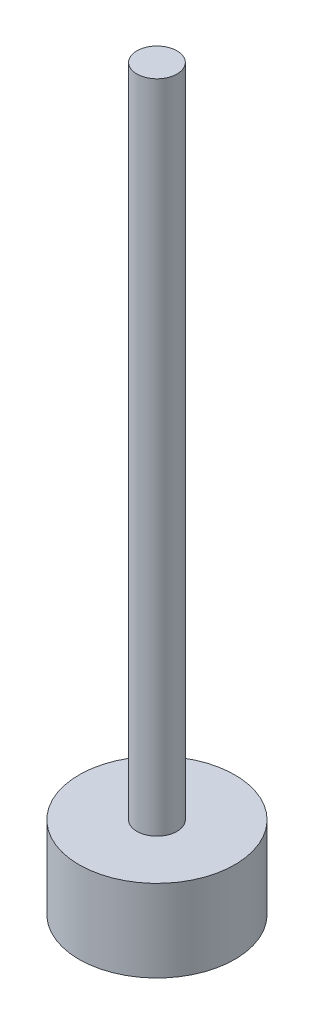
ISO-10303-21;
HEADER;
FILE_DESCRIPTION(('STEP AP214'),'2;1');
FILE_NAME('part.step','',(''),(''),'','','');
FILE_SCHEMA(('AUTOMOTIVE_DESIGN { 1 0 10303 214 1 1 1 1 }'));
ENDSEC;
DATA;
#1=APPLICATION_CONTEXT('core data for automotive mechanical design processes');
#2=APPLICATION_PROTOCOL_DEFINITION('international standard','automotive_design',2000,#1);
#3=PRODUCT_CONTEXT('',#1,'mechanical');
#4=PRODUCT('Part','Part','',(#3));
#5=PRODUCT_RELATED_PRODUCT_CATEGORY('part','',(#4));
#6=PRODUCT_DEFINITION_FORMATION('','',#4);
#7=PRODUCT_DEFINITION_CONTEXT('part definition',#1,'design');
#8=PRODUCT_DEFINITION('design','',#6,#7);
#9=PRODUCT_DEFINITION_SHAPE('','',#8);
#10=(LENGTH_UNIT() NAMED_UNIT(*) SI_UNIT(.MILLI.,.METRE.));
#11=(NAMED_UNIT(*) PLANE_ANGLE_UNIT() SI_UNIT($,.RADIAN.));
#12=(NAMED_UNIT(*) SI_UNIT($,.STERADIAN.) SOLID_ANGLE_UNIT());
#13=UNCERTAINTY_MEASURE_WITH_UNIT(LENGTH_MEASURE(1.E-05),#10,'distance_accuracy_value','');
#14=(GEOMETRIC_REPRESENTATION_CONTEXT(3) GLOBAL_UNCERTAINTY_ASSIGNED_CONTEXT((#13)) GLOBAL_UNIT_ASSIGNED_CONTEXT((#10,
#11,#12)) REPRESENTATION_CONTEXT('',''));
#15=CARTESIAN_POINT('',(0.,0.,0.));
#16=DIRECTION('',(0.,0.,1.));
#17=DIRECTION('',(1.,0.,0.));
#18=AXIS2_PLACEMENT_3D('',#15,#16,#17);
#19=CARTESIAN_POINT('',(0.,12.7,0.));
#20=DIRECTION('',(0.,-1.,0.));
#21=DIRECTION('',(0.,0.,-1.));
#22=AXIS2_PLACEMENT_3D('',#19,#20,#21);
#23=CYLINDRICAL_SURFACE('',#22,12.065);
#24=CARTESIAN_POINT('',(0.,12.7,0.));
#25=DIRECTION('',(0.,1.,0.));
#26=DIRECTION('',(0.,0.,1.));
#27=AXIS2_PLACEMENT_3D('',#24,#25,#26);
#28=CIRCLE('',#27,12.065);
#29=CARTESIAN_POINT('',(0.,12.7,12.065));
#30=VERTEX_POINT('',#29);
#31=EDGE_CURVE('E51',#30,#30,#28,.T.);
#32=ORIENTED_EDGE('',*,*,#31,.F.);
#33=EDGE_LOOP('',(#32));
#34=FACE_BOUND('',#33,.T.);
#35=CARTESIAN_POINT('',(0.,0.,0.));
#36=DIRECTION('',(0.,1.,0.));
#37=DIRECTION('',(0.,0.,1.));
#38=AXIS2_PLACEMENT_3D('',#35,#36,#37);
#39=CIRCLE('',#38,12.065);
#40=CARTESIAN_POINT('',(0.,0.,12.065));
#41=VERTEX_POINT('',#40);
#42=EDGE_CURVE('E46',#41,#41,#39,.T.);
#43=ORIENTED_EDGE('',*,*,#42,.T.);
#44=EDGE_LOOP('',(#43));
#45=FACE_BOUND('',#44,.T.);
#46=ADVANCED_FACE('F43',(#34,#45),#23,.T.);
#47=CARTESIAN_POINT('',(0.,12.7,0.));
#48=DIRECTION('',(0.,1.,0.));
#49=DIRECTION('',(0.,0.,1.));
#50=AXIS2_PLACEMENT_3D('',#47,#48,#49);
#51=PLANE('',#50);
#52=CARTESIAN_POINT('',(0.,12.7,0.));
#53=DIRECTION('',(0.,1.,0.));
#54=DIRECTION('',(0.,0.,1.));
#55=AXIS2_PLACEMENT_3D('',#52,#53,#54);
#56=CIRCLE('',#55,3.1115);
#57=CARTESIAN_POINT('',(0.,12.7,3.1115));
#58=VERTEX_POINT('',#57);
#59=EDGE_CURVE('E10',#58,#58,#56,.T.);
#60=ORIENTED_EDGE('',*,*,#59,.F.);
#61=EDGE_LOOP('',(#60));
#62=FACE_BOUND('',#61,.T.);
#63=ORIENTED_EDGE('',*,*,#31,.T.);
#64=EDGE_LOOP('',(#63));
#65=FACE_BOUND('',#64,.T.);
#66=ADVANCED_FACE('F71',(#62,#65),#51,.T.);
#67=CARTESIAN_POINT('',(0.,0.,0.));
#68=DIRECTION('',(0.,1.,0.));
#69=DIRECTION('',(0.,0.,1.));
#70=AXIS2_PLACEMENT_3D('',#67,#68,#69);
#71=PLANE('',#70);
#72=ORIENTED_EDGE('',*,*,#42,.F.);
#73=EDGE_LOOP('',(#72));
#74=FACE_BOUND('',#73,.T.);
#75=ADVANCED_FACE('F68',(#74),#71,.F.);
#76=CARTESIAN_POINT('',(0.,114.3,0.));
#77=DIRECTION('',(0.,-1.,0.));
#78=DIRECTION('',(0.,0.,-1.));
#79=AXIS2_PLACEMENT_3D('',#76,#77,#78);
#80=CYLINDRICAL_SURFACE('',#79,3.1115);
#81=CARTESIAN_POINT('',(0.,114.3,0.));
#82=DIRECTION('',(0.,1.,0.));
#83=DIRECTION('',(0.,0.,1.));
#84=AXIS2_PLACEMENT_3D('',#81,#82,#83);
#85=CIRCLE('',#84,3.1115);
#86=CARTESIAN_POINT('',(0.,114.3,3.1115));
#87=VERTEX_POINT('',#86);
#88=EDGE_CURVE('E58',#87,#87,#85,.T.);
#89=ORIENTED_EDGE('',*,*,#88,.F.);
#90=EDGE_LOOP('',(#89));
#91=FACE_BOUND('',#90,.T.);
#92=ORIENTED_EDGE('',*,*,#59,.T.);
#93=EDGE_LOOP('',(#92));
#94=FACE_BOUND('',#93,.T.);
#95=ADVANCED_FACE('F70',(#91,#94),#80,.T.);
#96=CARTESIAN_POINT('',(0.,114.3,0.));
#97=DIRECTION('',(0.,1.,0.));
#98=DIRECTION('',(0.,0.,1.));
#99=AXIS2_PLACEMENT_3D('',#96,#97,#98);
#100=PLANE('',#99);
#101=ORIENTED_EDGE('',*,*,#88,.T.);
#102=EDGE_LOOP('',(#101));
#103=FACE_BOUND('',#102,.T.);
#104=ADVANCED_FACE('F77',(#103),#100,.T.);
#105=CLOSED_SHELL('',(#46,#66,#75,#95,#104));
#106=MANIFOLD_SOLID_BREP('B2',#105);
#107=ADVANCED_BREP_SHAPE_REPRESENTATION('',(#18,#106),#14);
#108=SHAPE_DEFINITION_REPRESENTATION(#9,#107);
ENDSEC;
END-ISO-10303-21;
